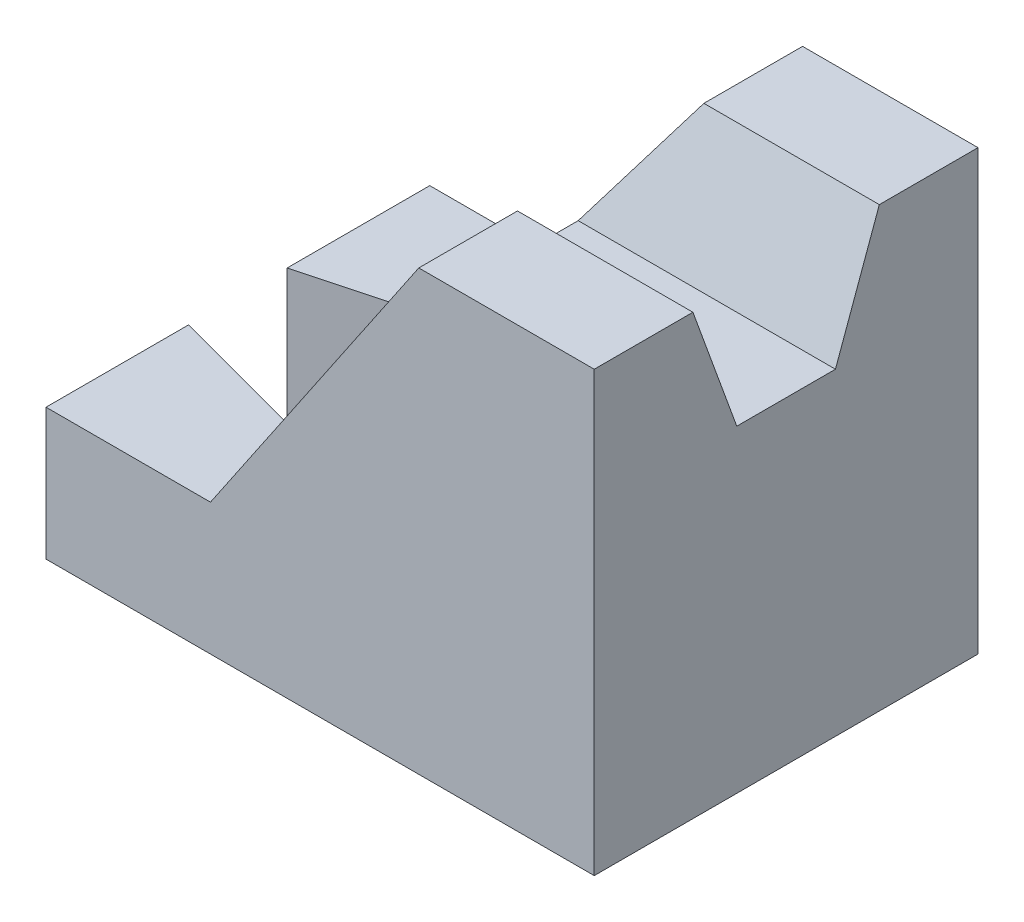
ISO-10303-21;
HEADER;
FILE_DESCRIPTION(('STEP AP214'),'2;1');
FILE_NAME('part.step','',(''),(''),'','','');
FILE_SCHEMA(('AUTOMOTIVE_DESIGN { 1 0 10303 214 1 1 1 1 }'));
ENDSEC;
DATA;
#1=APPLICATION_CONTEXT('core data for automotive mechanical design processes');
#2=APPLICATION_PROTOCOL_DEFINITION('international standard','automotive_design',2000,#1);
#3=PRODUCT_CONTEXT('',#1,'mechanical');
#4=PRODUCT('Part','Part','',(#3));
#5=PRODUCT_RELATED_PRODUCT_CATEGORY('part','',(#4));
#6=PRODUCT_DEFINITION_FORMATION('','',#4);
#7=PRODUCT_DEFINITION_CONTEXT('part definition',#1,'design');
#8=PRODUCT_DEFINITION('design','',#6,#7);
#9=PRODUCT_DEFINITION_SHAPE('','',#8);
#10=(LENGTH_UNIT() NAMED_UNIT(*) SI_UNIT(.MILLI.,.METRE.));
#11=(NAMED_UNIT(*) PLANE_ANGLE_UNIT() SI_UNIT($,.RADIAN.));
#12=(NAMED_UNIT(*) SI_UNIT($,.STERADIAN.) SOLID_ANGLE_UNIT());
#13=UNCERTAINTY_MEASURE_WITH_UNIT(LENGTH_MEASURE(1.E-05),#10,'distance_accuracy_value','');
#14=(GEOMETRIC_REPRESENTATION_CONTEXT(3) GLOBAL_UNCERTAINTY_ASSIGNED_CONTEXT((#13)) GLOBAL_UNIT_ASSIGNED_CONTEXT((#10,
#11,#12)) REPRESENTATION_CONTEXT('',''));
#15=CARTESIAN_POINT('',(0.,0.,0.));
#16=DIRECTION('',(0.,0.,1.));
#17=DIRECTION('',(1.,0.,0.));
#18=AXIS2_PLACEMENT_3D('',#15,#16,#17);
#19=CARTESIAN_POINT('',(0.,80.,0.));
#20=DIRECTION('',(0.,-1.,0.));
#21=DIRECTION('',(0.,0.,-1.));
#22=AXIS2_PLACEMENT_3D('',#19,#20,#21);
#23=PLANE('',#22);
#24=CARTESIAN_POINT('',(68.,80.,0.));
#25=DIRECTION('',(0.,0.,1.));
#26=VECTOR('',#25,1.);
#27=LINE('',#24,#26);
#28=CARTESIAN_POINT('',(68.,80.,0.));
#29=VERTEX_POINT('',#28);
#30=CARTESIAN_POINT('',(68.,80.,18.));
#31=VERTEX_POINT('',#30);
#32=EDGE_CURVE('E341',#29,#31,#27,.T.);
#33=ORIENTED_EDGE('',*,*,#32,.T.);
#34=DIRECTION('',(1.,0.,0.));
#35=VECTOR('',#34,1.);
#36=CARTESIAN_POINT('',(0.,80.,18.));
#37=LINE('',#36,#35);
#38=CARTESIAN_POINT('',(100.,80.,18.));
#39=VERTEX_POINT('',#38);
#40=EDGE_CURVE('E91',#31,#39,#37,.T.);
#41=ORIENTED_EDGE('',*,*,#40,.T.);
#42=CARTESIAN_POINT('',(100.,80.,0.));
#43=DIRECTION('',(0.,0.,1.));
#44=VECTOR('',#43,1.);
#45=LINE('',#42,#44);
#46=CARTESIAN_POINT('',(100.,80.,0.));
#47=VERTEX_POINT('',#46);
#48=EDGE_CURVE('E477',#47,#39,#45,.T.);
#49=ORIENTED_EDGE('',*,*,#48,.F.);
#50=DIRECTION('',(-1.,0.,0.));
#51=VECTOR('',#50,1.);
#52=CARTESIAN_POINT('',(100.,80.,0.));
#53=LINE('',#52,#51);
#54=EDGE_CURVE('E543',#47,#29,#53,.T.);
#55=ORIENTED_EDGE('',*,*,#54,.T.);
#56=EDGE_LOOP('',(#33,#41,#49,#55));
#57=FACE_BOUND('',#56,.T.);
#58=ADVANCED_FACE('F81',(#57),#23,.F.);
#59=CARTESIAN_POINT('',(0.,24.,0.));
#60=DIRECTION('',(0.,-1.,0.));
#61=DIRECTION('',(0.,0.,-1.));
#62=AXIS2_PLACEMENT_3D('',#59,#60,#61);
#63=PLANE('',#62);
#64=DIRECTION('',(0.,0.,-1.));
#65=VECTOR('',#64,1.);
#66=CARTESIAN_POINT('',(0.,24.,70.));
#67=LINE('',#66,#65);
#68=CARTESIAN_POINT('',(0.,24.,25.9999999997143));
#69=VERTEX_POINT('',#68);
#70=CARTESIAN_POINT('',(0.,24.,0.));
#71=VERTEX_POINT('',#70);
#72=EDGE_CURVE('E609',#69,#71,#67,.T.);
#73=ORIENTED_EDGE('',*,*,#72,.F.);
#74=DIRECTION('',(0.966234939603537,0.,-0.257662650551741));
#75=VECTOR('',#74,1.);
#76=CARTESIAN_POINT('',(6.47302904537154,24.,24.2738589210102));
#77=LINE('',#76,#75);
#78=CARTESIAN_POINT('',(30.,24.,18.));
#79=VERTEX_POINT('',#78);
#80=EDGE_CURVE('E332',#69,#79,#77,.T.);
#81=ORIENTED_EDGE('',*,*,#80,.T.);
#82=CARTESIAN_POINT('',(30.,24.,0.));
#83=DIRECTION('',(0.,0.,1.));
#84=VECTOR('',#83,1.);
#85=LINE('',#82,#84);
#86=CARTESIAN_POINT('',(30.,24.,0.));
#87=VERTEX_POINT('',#86);
#88=EDGE_CURVE('E608',#87,#79,#85,.T.);
#89=ORIENTED_EDGE('',*,*,#88,.F.);
#90=DIRECTION('',(1.,0.,0.));
#91=VECTOR('',#90,1.);
#92=CARTESIAN_POINT('',(0.,24.,0.));
#93=LINE('',#92,#91);
#94=EDGE_CURVE('E625',#71,#87,#93,.T.);
#95=ORIENTED_EDGE('',*,*,#94,.F.);
#96=EDGE_LOOP('',(#73,#81,#89,#95));
#97=FACE_BOUND('',#96,.T.);
#98=ADVANCED_FACE('F728',(#97),#63,.F.);
#99=CARTESIAN_POINT('',(0.,0.,0.));
#100=DIRECTION('',(-1.,0.,0.));
#101=DIRECTION('',(0.,0.,1.));
#102=AXIS2_PLACEMENT_3D('',#99,#100,#101);
#103=PLANE('',#102);
#104=DIRECTION('',(0.,-1.,0.));
#105=VECTOR('',#104,1.);
#106=CARTESIAN_POINT('',(0.,0.,25.9999999997143));
#107=LINE('',#106,#105);
#108=CARTESIAN_POINT('',(0.,0.,25.9999999997143));
#109=VERTEX_POINT('',#108);
#110=EDGE_CURVE('E324',#69,#109,#107,.T.);
#111=ORIENTED_EDGE('',*,*,#110,.F.);
#112=ORIENTED_EDGE('',*,*,#72,.T.);
#113=CARTESIAN_POINT('',(0.,0.,0.));
#114=DIRECTION('',(0.,1.,0.));
#115=VECTOR('',#114,1.);
#116=LINE('',#113,#115);
#117=CARTESIAN_POINT('',(0.,0.,0.));
#118=VERTEX_POINT('',#117);
#119=EDGE_CURVE('E560',#118,#71,#116,.T.);
#120=ORIENTED_EDGE('',*,*,#119,.F.);
#121=DIRECTION('',(0.,0.,-1.));
#122=VECTOR('',#121,1.);
#123=CARTESIAN_POINT('',(0.,0.,70.));
#124=LINE('',#123,#122);
#125=EDGE_CURVE('E553',#109,#118,#124,.T.);
#126=ORIENTED_EDGE('',*,*,#125,.F.);
#127=EDGE_LOOP('',(#111,#112,#120,#126));
#128=FACE_BOUND('',#127,.T.);
#129=ADVANCED_FACE('F576',(#128),#103,.T.);
#130=CARTESIAN_POINT('',(30.,24.,52.));
#131=DIRECTION('',(0.,0.,1.));
#132=VECTOR('',#131,1.);
#133=LINE('',#130,#132);
#134=CARTESIAN_POINT('',(30.,24.,52.));
#135=VERTEX_POINT('',#134);
#136=CARTESIAN_POINT('',(30.,24.,70.));
#137=VERTEX_POINT('',#136);
#138=EDGE_CURVE('E545',#135,#137,#133,.T.);
#139=ORIENTED_EDGE('',*,*,#138,.F.);
#140=DIRECTION('',(-0.966234939603537,0.,-0.257662650551741));
#141=VECTOR('',#140,1.);
#142=CARTESIAN_POINT('',(-10.9543568462049,24.,41.0788381747354));
#143=LINE('',#142,#141);
#144=CARTESIAN_POINT('',(0.,24.,44.0000000002857));
#145=VERTEX_POINT('',#144);
#146=EDGE_CURVE('E319',#135,#145,#143,.T.);
#147=ORIENTED_EDGE('',*,*,#146,.T.);
#148=CARTESIAN_POINT('',(0.,24.,70.));
#149=VERTEX_POINT('',#148);
#150=EDGE_CURVE('E612',#149,#145,#67,.T.);
#151=ORIENTED_EDGE('',*,*,#150,.F.);
#152=DIRECTION('',(-1.,0.,0.));
#153=VECTOR('',#152,1.);
#154=CARTESIAN_POINT('',(100.,24.,70.));
#155=LINE('',#154,#153);
#156=EDGE_CURVE('E677',#137,#149,#155,.T.);
#157=ORIENTED_EDGE('',*,*,#156,.F.);
#158=EDGE_LOOP('',(#139,#147,#151,#157));
#159=FACE_BOUND('',#158,.T.);
#160=ADVANCED_FACE('F83',(#159),#63,.F.);
#161=CARTESIAN_POINT('',(0.,0.,0.));
#162=DIRECTION('',(0.,-1.,0.));
#163=DIRECTION('',(0.,0.,-1.));
#164=AXIS2_PLACEMENT_3D('',#161,#162,#163);
#165=PLANE('',#164);
#166=DIRECTION('',(0.966234939603537,0.,-0.257662650551741));
#167=VECTOR('',#166,1.);
#168=CARTESIAN_POINT('',(6.47302904537154,0.,24.2738589210102));
#169=LINE('',#168,#167);
#170=CARTESIAN_POINT('',(30.,0.,18.));
#171=VERTEX_POINT('',#170);
#172=EDGE_CURVE('E328',#109,#171,#169,.T.);
#173=ORIENTED_EDGE('',*,*,#172,.F.);
#174=ORIENTED_EDGE('',*,*,#125,.T.);
#175=DIRECTION('',(1.,0.,0.));
#176=VECTOR('',#175,1.);
#177=CARTESIAN_POINT('',(0.,0.,0.));
#178=LINE('',#177,#176);
#179=CARTESIAN_POINT('',(100.,0.,0.));
#180=VERTEX_POINT('',#179);
#181=EDGE_CURVE('E628',#118,#180,#178,.T.);
#182=ORIENTED_EDGE('',*,*,#181,.T.);
#183=DIRECTION('',(0.,0.,1.));
#184=VECTOR('',#183,1.);
#185=CARTESIAN_POINT('',(100.,0.,0.));
#186=LINE('',#185,#184);
#187=CARTESIAN_POINT('',(100.,0.,70.));
#188=VERTEX_POINT('',#187);
#189=EDGE_CURVE('E640',#180,#188,#186,.T.);
#190=ORIENTED_EDGE('',*,*,#189,.T.);
#191=DIRECTION('',(-1.,0.,0.));
#192=VECTOR('',#191,1.);
#193=CARTESIAN_POINT('',(100.,0.,70.));
#194=LINE('',#193,#192);
#195=CARTESIAN_POINT('',(0.,0.,70.));
#196=VERTEX_POINT('',#195);
#197=EDGE_CURVE('E635',#188,#196,#194,.T.);
#198=ORIENTED_EDGE('',*,*,#197,.T.);
#199=CARTESIAN_POINT('',(0.,0.,44.0000000002857));
#200=VERTEX_POINT('',#199);
#201=EDGE_CURVE('E626',#196,#200,#124,.T.);
#202=ORIENTED_EDGE('',*,*,#201,.T.);
#203=DIRECTION('',(-0.966234939603537,0.,-0.257662650551741));
#204=VECTOR('',#203,1.);
#205=CARTESIAN_POINT('',(-10.9543568462049,0.,41.0788381747354));
#206=LINE('',#205,#204);
#207=CARTESIAN_POINT('',(30.,0.,52.));
#208=VERTEX_POINT('',#207);
#209=EDGE_CURVE('E315',#208,#200,#206,.T.);
#210=ORIENTED_EDGE('',*,*,#209,.F.);
#211=DIRECTION('',(0.,0.,1.));
#212=VECTOR('',#211,1.);
#213=CARTESIAN_POINT('',(30.,0.,0.));
#214=LINE('',#213,#212);
#215=EDGE_CURVE('E304',#171,#208,#214,.T.);
#216=ORIENTED_EDGE('',*,*,#215,.F.);
#217=EDGE_LOOP('',(#173,#174,#182,#190,#198,#202,#210,#216));
#218=FACE_BOUND('',#217,.T.);
#219=ADVANCED_FACE('F491',(#218),#165,.T.);
#220=DIRECTION('',(0.,1.,0.));
#221=VECTOR('',#220,1.);
#222=CARTESIAN_POINT('',(0.,0.,44.0000000002857));
#223=LINE('',#222,#221);
#224=EDGE_CURVE('E311',#200,#145,#223,.T.);
#225=ORIENTED_EDGE('',*,*,#224,.F.);
#226=ORIENTED_EDGE('',*,*,#201,.F.);
#227=CARTESIAN_POINT('',(0.,0.,70.));
#228=DIRECTION('',(0.,1.,0.));
#229=VECTOR('',#228,1.);
#230=LINE('',#227,#229);
#231=EDGE_CURVE('E639',#196,#149,#230,.T.);
#232=ORIENTED_EDGE('',*,*,#231,.T.);
#233=ORIENTED_EDGE('',*,*,#150,.T.);
#234=EDGE_LOOP('',(#225,#226,#232,#233));
#235=FACE_BOUND('',#234,.T.);
#236=ADVANCED_FACE('F566',(#235),#103,.T.);
#237=CARTESIAN_POINT('',(0.,0.,0.));
#238=DIRECTION('',(0.,0.,-1.));
#239=DIRECTION('',(-1.,0.,0.));
#240=AXIS2_PLACEMENT_3D('',#237,#238,#239);
#241=PLANE('',#240);
#242=ORIENTED_EDGE('',*,*,#119,.T.);
#243=ORIENTED_EDGE('',*,*,#94,.T.);
#244=DIRECTION('',(-0.561501418337265,-0.827475774391758,0.));
#245=VECTOR('',#244,1.);
#246=CARTESIAN_POINT('',(68.,80.,0.));
#247=LINE('',#246,#245);
#248=EDGE_CURVE('E336',#29,#87,#247,.T.);
#249=ORIENTED_EDGE('',*,*,#248,.F.);
#250=ORIENTED_EDGE('',*,*,#54,.F.);
#251=DIRECTION('',(0.,1.,0.));
#252=VECTOR('',#251,1.);
#253=CARTESIAN_POINT('',(100.,24.,0.));
#254=LINE('',#253,#252);
#255=CARTESIAN_POINT('',(100.,24.,0.));
#256=VERTEX_POINT('',#255);
#257=EDGE_CURVE('E415',#256,#47,#254,.T.);
#258=ORIENTED_EDGE('',*,*,#257,.F.);
#259=CARTESIAN_POINT('',(100.,0.,0.));
#260=DIRECTION('',(0.,1.,0.));
#261=VECTOR('',#260,1.);
#262=LINE('',#259,#261);
#263=EDGE_CURVE('E613',#180,#256,#262,.T.);
#264=ORIENTED_EDGE('',*,*,#263,.F.);
#265=ORIENTED_EDGE('',*,*,#181,.F.);
#266=EDGE_LOOP('',(#242,#243,#249,#250,#258,#264,#265));
#267=FACE_BOUND('',#266,.T.);
#268=ADVANCED_FACE('F574',(#267),#241,.T.);
#269=CARTESIAN_POINT('',(0.,0.,70.));
#270=DIRECTION('',(0.,0.,1.));
#271=DIRECTION('',(1.,0.,0.));
#272=AXIS2_PLACEMENT_3D('',#269,#270,#271);
#273=PLANE('',#272);
#274=CARTESIAN_POINT('',(100.,0.,70.));
#275=DIRECTION('',(0.,1.,0.));
#276=VECTOR('',#275,1.);
#277=LINE('',#274,#276);
#278=CARTESIAN_POINT('',(100.,24.,70.));
#279=VERTEX_POINT('',#278);
#280=EDGE_CURVE('E693',#188,#279,#277,.T.);
#281=ORIENTED_EDGE('',*,*,#280,.T.);
#282=DIRECTION('',(0.,1.,0.));
#283=VECTOR('',#282,1.);
#284=CARTESIAN_POINT('',(100.,24.,70.));
#285=LINE('',#284,#283);
#286=CARTESIAN_POINT('',(100.,80.,70.));
#287=VERTEX_POINT('',#286);
#288=EDGE_CURVE('E442',#279,#287,#285,.T.);
#289=ORIENTED_EDGE('',*,*,#288,.T.);
#290=DIRECTION('',(-1.,0.,0.));
#291=VECTOR('',#290,1.);
#292=CARTESIAN_POINT('',(100.,80.,70.));
#293=LINE('',#292,#291);
#294=CARTESIAN_POINT('',(68.,80.,70.));
#295=VERTEX_POINT('',#294);
#296=EDGE_CURVE('E452',#287,#295,#293,.T.);
#297=ORIENTED_EDGE('',*,*,#296,.T.);
#298=DIRECTION('',(-0.561501418337265,-0.827475774391758,0.));
#299=VECTOR('',#298,1.);
#300=CARTESIAN_POINT('',(68.,80.,70.));
#301=LINE('',#300,#299);
#302=EDGE_CURVE('E429',#295,#137,#301,.T.);
#303=ORIENTED_EDGE('',*,*,#302,.T.);
#304=ORIENTED_EDGE('',*,*,#156,.T.);
#305=ORIENTED_EDGE('',*,*,#231,.F.);
#306=ORIENTED_EDGE('',*,*,#197,.F.);
#307=EDGE_LOOP('',(#281,#289,#297,#303,#304,#305,#306));
#308=FACE_BOUND('',#307,.T.);
#309=ADVANCED_FACE('F382',(#308),#273,.T.);
#310=CARTESIAN_POINT('',(100.,0.,0.));
#311=DIRECTION('',(1.,0.,0.));
#312=DIRECTION('',(0.,0.,-1.));
#313=AXIS2_PLACEMENT_3D('',#310,#311,#312);
#314=PLANE('',#313);
#315=DIRECTION('',(0.,0.939793423488437,-0.341743063086704));
#316=VECTOR('',#315,1.);
#317=CARTESIAN_POINT('',(100.,15.1240875912409,41.5912408759124));
#318=LINE('',#317,#316);
#319=CARTESIAN_POINT('',(100.,58.,26.));
#320=VERTEX_POINT('',#319);
#321=EDGE_CURVE('E717',#320,#39,#318,.T.);
#322=ORIENTED_EDGE('',*,*,#321,.F.);
#323=DIRECTION('',(0.,0.,-1.));
#324=VECTOR('',#323,1.);
#325=CARTESIAN_POINT('',(100.,58.,0.));
#326=LINE('',#325,#324);
#327=CARTESIAN_POINT('',(100.,58.,44.));
#328=VERTEX_POINT('',#327);
#329=EDGE_CURVE('E716',#328,#320,#326,.T.);
#330=ORIENTED_EDGE('',*,*,#329,.F.);
#331=DIRECTION('',(0.,-0.939793423488437,-0.341743063086704));
#332=VECTOR('',#331,1.);
#333=CARTESIAN_POINT('',(100.,-7.35766423357664,20.2335766423358));
#334=LINE('',#333,#332);
#335=CARTESIAN_POINT('',(100.,80.,52.));
#336=VERTEX_POINT('',#335);
#337=EDGE_CURVE('E205',#336,#328,#334,.T.);
#338=ORIENTED_EDGE('',*,*,#337,.F.);
#339=CARTESIAN_POINT('',(100.,80.,52.));
#340=DIRECTION('',(0.,0.,1.));
#341=VECTOR('',#340,1.);
#342=LINE('',#339,#341);
#343=EDGE_CURVE('E362',#336,#287,#342,.T.);
#344=ORIENTED_EDGE('',*,*,#343,.T.);
#345=ORIENTED_EDGE('',*,*,#288,.F.);
#346=ORIENTED_EDGE('',*,*,#280,.F.);
#347=ORIENTED_EDGE('',*,*,#189,.F.);
#348=ORIENTED_EDGE('',*,*,#263,.T.);
#349=ORIENTED_EDGE('',*,*,#257,.T.);
#350=ORIENTED_EDGE('',*,*,#48,.T.);
#351=EDGE_LOOP('',(#322,#330,#338,#344,#345,#346,#347,#348,#349,#350));
#352=FACE_BOUND('',#351,.T.);
#353=ADVANCED_FACE('F373',(#352),#314,.T.);
#354=CARTESIAN_POINT('',(9.39039301310044,-6.37205240174673,0.));
#355=DIRECTION('',(0.827475774391758,-0.561501418337265,0.));
#356=DIRECTION('',(0.561501418337265,0.827475774391758,0.));
#357=AXIS2_PLACEMENT_3D('',#354,#355,#356);
#358=PLANE('',#357);
#359=DIRECTION('',(0.,0.,-1.));
#360=VECTOR('',#359,1.);
#361=CARTESIAN_POINT('',(53.0714285714286,58.,0.));
#362=LINE('',#361,#360);
#363=CARTESIAN_POINT('',(53.0714285714286,58.,44.));
#364=VERTEX_POINT('',#363);
#365=CARTESIAN_POINT('',(53.0714285714286,58.,26.));
#366=VERTEX_POINT('',#365);
#367=EDGE_CURVE('E12',#364,#366,#362,.T.);
#368=ORIENTED_EDGE('',*,*,#367,.T.);
#369=DIRECTION('',(0.537687404020233,0.792381437503502,-0.288138704546728));
#370=VECTOR('',#369,1.);
#371=CARTESIAN_POINT('',(17.0451058647552,4.90857706384979,45.3059719767819));
#372=LINE('',#371,#370);
#373=EDGE_CURVE('E213',#366,#31,#372,.T.);
#374=ORIENTED_EDGE('',*,*,#373,.T.);
#375=ORIENTED_EDGE('',*,*,#32,.F.);
#376=ORIENTED_EDGE('',*,*,#248,.T.);
#377=ORIENTED_EDGE('',*,*,#88,.T.);
#378=DIRECTION('',(0.,0.,1.));
#379=VECTOR('',#378,1.);
#380=CARTESIAN_POINT('',(30.,24.,0.));
#381=LINE('',#380,#379);
#382=EDGE_CURVE('E463',#79,#135,#381,.T.);
#383=ORIENTED_EDGE('',*,*,#382,.T.);
#384=ORIENTED_EDGE('',*,*,#138,.T.);
#385=ORIENTED_EDGE('',*,*,#302,.F.);
#386=CARTESIAN_POINT('',(68.,80.,52.));
#387=DIRECTION('',(0.,0.,1.));
#388=VECTOR('',#387,1.);
#389=LINE('',#386,#388);
#390=CARTESIAN_POINT('',(68.,80.,52.));
#391=VERTEX_POINT('',#390);
#392=EDGE_CURVE('E210',#391,#295,#389,.T.);
#393=ORIENTED_EDGE('',*,*,#392,.F.);
#394=DIRECTION('',(-0.537687404020233,-0.792381437503502,-0.288138704546728));
#395=VECTOR('',#394,1.);
#396=CARTESIAN_POINT('',(6.2001072215714,-11.0735261997895,18.8823541091674));
#397=LINE('',#396,#395);
#398=EDGE_CURVE('E99',#391,#364,#397,.T.);
#399=ORIENTED_EDGE('',*,*,#398,.T.);
#400=EDGE_LOOP('',(#368,#374,#375,#376,#377,#383,#384,#385,#393,#399));
#401=FACE_BOUND('',#400,.T.);
#402=ADVANCED_FACE('F208',(#401),#358,.F.);
#403=ORIENTED_EDGE('',*,*,#343,.F.);
#404=DIRECTION('',(-1.,0.,0.));
#405=VECTOR('',#404,1.);
#406=CARTESIAN_POINT('',(0.,80.,52.));
#407=LINE('',#406,#405);
#408=EDGE_CURVE('E766',#336,#391,#407,.T.);
#409=ORIENTED_EDGE('',*,*,#408,.T.);
#410=ORIENTED_EDGE('',*,*,#392,.T.);
#411=ORIENTED_EDGE('',*,*,#296,.F.);
#412=EDGE_LOOP('',(#403,#409,#410,#411));
#413=FACE_BOUND('',#412,.T.);
#414=ADVANCED_FACE('F252',(#413),#23,.F.);
#415=CARTESIAN_POINT('',(6.47302904537154,0.,24.2738589210102));
#416=DIRECTION('',(-0.257662650551741,0.,-0.966234939603537));
#417=DIRECTION('',(-0.966234939603537,0.,0.257662650551741));
#418=AXIS2_PLACEMENT_3D('',#415,#416,#417);
#419=PLANE('',#418);
#420=ORIENTED_EDGE('',*,*,#110,.T.);
#421=ORIENTED_EDGE('',*,*,#172,.T.);
#422=CARTESIAN_POINT('',(30.,0.,18.));
#423=DIRECTION('',(0.,1.,0.));
#424=VECTOR('',#423,1.);
#425=LINE('',#422,#424);
#426=EDGE_CURVE('E276',#171,#79,#425,.T.);
#427=ORIENTED_EDGE('',*,*,#426,.T.);
#428=ORIENTED_EDGE('',*,*,#80,.F.);
#429=EDGE_LOOP('',(#420,#421,#427,#428));
#430=FACE_BOUND('',#429,.T.);
#431=ADVANCED_FACE('F247',(#430),#419,.F.);
#432=CARTESIAN_POINT('',(-10.9543568462049,0.,41.0788381747354));
#433=DIRECTION('',(-0.257662650551741,0.,0.966234939603537));
#434=DIRECTION('',(0.966234939603537,0.,0.257662650551741));
#435=AXIS2_PLACEMENT_3D('',#432,#433,#434);
#436=PLANE('',#435);
#437=CARTESIAN_POINT('',(30.,0.,52.));
#438=DIRECTION('',(0.,1.,0.));
#439=VECTOR('',#438,1.);
#440=LINE('',#437,#439);
#441=EDGE_CURVE('E107',#208,#135,#440,.T.);
#442=ORIENTED_EDGE('',*,*,#441,.F.);
#443=ORIENTED_EDGE('',*,*,#209,.T.);
#444=ORIENTED_EDGE('',*,*,#224,.T.);
#445=ORIENTED_EDGE('',*,*,#146,.F.);
#446=EDGE_LOOP('',(#442,#443,#444,#445));
#447=FACE_BOUND('',#446,.T.);
#448=ADVANCED_FACE('F251',(#447),#436,.F.);
#449=CARTESIAN_POINT('',(30.,0.,0.));
#450=DIRECTION('',(1.,0.,0.));
#451=DIRECTION('',(0.,0.,-1.));
#452=AXIS2_PLACEMENT_3D('',#449,#450,#451);
#453=PLANE('',#452);
#454=ORIENTED_EDGE('',*,*,#215,.T.);
#455=ORIENTED_EDGE('',*,*,#441,.T.);
#456=ORIENTED_EDGE('',*,*,#382,.F.);
#457=ORIENTED_EDGE('',*,*,#426,.F.);
#458=EDGE_LOOP('',(#454,#455,#456,#457));
#459=FACE_BOUND('',#458,.T.);
#460=ADVANCED_FACE('F241',(#459),#453,.F.);
#461=CARTESIAN_POINT('',(0.,58.,0.));
#462=DIRECTION('',(0.,-1.,0.));
#463=DIRECTION('',(0.,0.,-1.));
#464=AXIS2_PLACEMENT_3D('',#461,#462,#463);
#465=PLANE('',#464);
#466=ORIENTED_EDGE('',*,*,#329,.T.);
#467=CARTESIAN_POINT('',(53.0714285714286,58.,26.));
#468=DIRECTION('',(1.,0.,0.));
#469=VECTOR('',#468,1.);
#470=LINE('',#467,#469);
#471=EDGE_CURVE('E198',#366,#320,#470,.T.);
#472=ORIENTED_EDGE('',*,*,#471,.F.);
#473=ORIENTED_EDGE('',*,*,#367,.F.);
#474=CARTESIAN_POINT('',(53.0714285714286,58.,44.));
#475=DIRECTION('',(1.,0.,0.));
#476=VECTOR('',#475,1.);
#477=LINE('',#474,#476);
#478=EDGE_CURVE('E194',#364,#328,#477,.T.);
#479=ORIENTED_EDGE('',*,*,#478,.T.);
#480=EDGE_LOOP('',(#466,#472,#473,#479));
#481=FACE_BOUND('',#480,.T.);
#482=ADVANCED_FACE('F193',(#481),#465,.F.);
#483=CARTESIAN_POINT('',(0.,15.1240875912409,41.5912408759124));
#484=DIRECTION('',(0.,-0.341743063086704,-0.939793423488437));
#485=DIRECTION('',(0.,0.939793423488437,-0.341743063086704));
#486=AXIS2_PLACEMENT_3D('',#483,#484,#485);
#487=PLANE('',#486);
#488=ORIENTED_EDGE('',*,*,#321,.T.);
#489=ORIENTED_EDGE('',*,*,#40,.F.);
#490=ORIENTED_EDGE('',*,*,#373,.F.);
#491=ORIENTED_EDGE('',*,*,#471,.T.);
#492=EDGE_LOOP('',(#488,#489,#490,#491));
#493=FACE_BOUND('',#492,.T.);
#494=ADVANCED_FACE('F240',(#493),#487,.F.);
#495=CARTESIAN_POINT('',(0.,-7.35766423357664,20.2335766423358));
#496=DIRECTION('',(0.,-0.341743063086704,0.939793423488437));
#497=DIRECTION('',(0.,-0.939793423488437,-0.341743063086704));
#498=AXIS2_PLACEMENT_3D('',#495,#496,#497);
#499=PLANE('',#498);
#500=ORIENTED_EDGE('',*,*,#337,.T.);
#501=ORIENTED_EDGE('',*,*,#478,.F.);
#502=ORIENTED_EDGE('',*,*,#398,.F.);
#503=ORIENTED_EDGE('',*,*,#408,.F.);
#504=EDGE_LOOP('',(#500,#501,#502,#503));
#505=FACE_BOUND('',#504,.T.);
#506=ADVANCED_FACE('F203',(#505),#499,.F.);
#507=CLOSED_SHELL('',(#58,#98,#129,#160,#219,#236,#268,#309,#353,#402,#414,#431,#448,#460,#482,
#494,#506));
#508=MANIFOLD_SOLID_BREP('B2',#507);
#509=ADVANCED_BREP_SHAPE_REPRESENTATION('',(#18,#508),#14);
#510=SHAPE_DEFINITION_REPRESENTATION(#9,#509);
ENDSEC;
END-ISO-10303-21;
